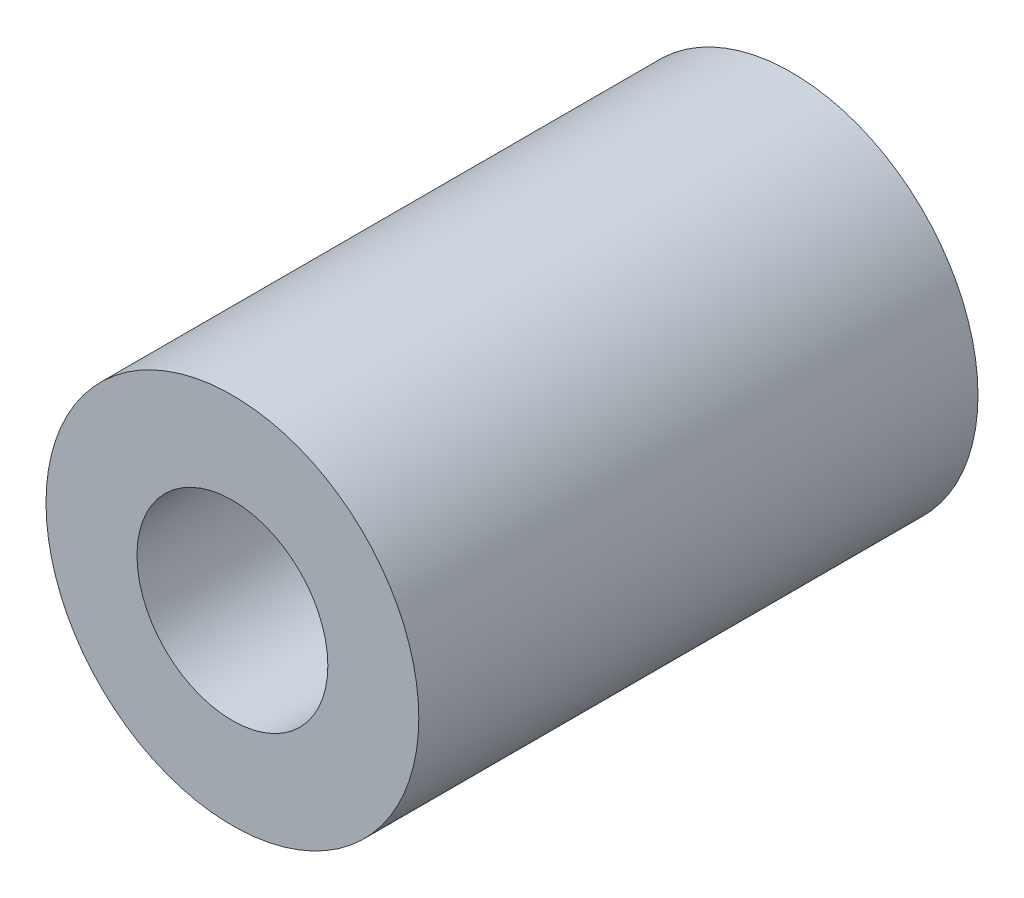
ISO-10303-21;
HEADER;
FILE_DESCRIPTION(('STEP AP214'),'2;1');
FILE_NAME('part.step','',(''),(''),'','','');
FILE_SCHEMA(('AUTOMOTIVE_DESIGN { 1 0 10303 214 1 1 1 1 }'));
ENDSEC;
DATA;
#1=APPLICATION_CONTEXT('core data for automotive mechanical design processes');
#2=APPLICATION_PROTOCOL_DEFINITION('international standard','automotive_design',2000,#1);
#3=PRODUCT_CONTEXT('',#1,'mechanical');
#4=PRODUCT('Part','Part','',(#3));
#5=PRODUCT_RELATED_PRODUCT_CATEGORY('part','',(#4));
#6=PRODUCT_DEFINITION_FORMATION('','',#4);
#7=PRODUCT_DEFINITION_CONTEXT('part definition',#1,'design');
#8=PRODUCT_DEFINITION('design','',#6,#7);
#9=PRODUCT_DEFINITION_SHAPE('','',#8);
#10=(LENGTH_UNIT() NAMED_UNIT(*) SI_UNIT(.MILLI.,.METRE.));
#11=(NAMED_UNIT(*) PLANE_ANGLE_UNIT() SI_UNIT($,.RADIAN.));
#12=(NAMED_UNIT(*) SI_UNIT($,.STERADIAN.) SOLID_ANGLE_UNIT());
#13=UNCERTAINTY_MEASURE_WITH_UNIT(LENGTH_MEASURE(1.E-05),#10,'distance_accuracy_value','');
#14=(GEOMETRIC_REPRESENTATION_CONTEXT(3) GLOBAL_UNCERTAINTY_ASSIGNED_CONTEXT((#13)) GLOBAL_UNIT_ASSIGNED_CONTEXT((#10,
#11,#12)) REPRESENTATION_CONTEXT('',''));
#15=CARTESIAN_POINT('',(0.,0.,0.));
#16=DIRECTION('',(0.,0.,1.));
#17=DIRECTION('',(1.,0.,0.));
#18=AXIS2_PLACEMENT_3D('',#15,#16,#17);
#19=CARTESIAN_POINT('',(0.,0.,7.14375));
#20=DIRECTION('',(0.,0.,-1.));
#21=DIRECTION('',(-1.,0.,0.));
#22=AXIS2_PLACEMENT_3D('',#19,#20,#21);
#23=CYLINDRICAL_SURFACE('',#22,2.4384);
#24=CARTESIAN_POINT('',(0.,0.,-7.14375));
#25=DIRECTION('',(0.,0.,-1.));
#26=DIRECTION('',(-1.,0.,0.));
#27=AXIS2_PLACEMENT_3D('',#24,#25,#26);
#28=CIRCLE('',#27,2.4384);
#29=CARTESIAN_POINT('',(-2.4384,0.,-7.14375));
#30=VERTEX_POINT('',#29);
#31=EDGE_CURVE('E38',#30,#30,#28,.T.);
#32=ORIENTED_EDGE('',*,*,#31,.T.);
#33=EDGE_LOOP('',(#32));
#34=FACE_BOUND('',#33,.T.);
#35=CARTESIAN_POINT('',(0.,0.,7.14375));
#36=DIRECTION('',(0.,0.,-1.));
#37=DIRECTION('',(-1.,0.,0.));
#38=AXIS2_PLACEMENT_3D('',#35,#36,#37);
#39=CIRCLE('',#38,2.4384);
#40=CARTESIAN_POINT('',(-2.4384,0.,7.14375));
#41=VERTEX_POINT('',#40);
#42=EDGE_CURVE('E25',#41,#41,#39,.T.);
#43=ORIENTED_EDGE('',*,*,#42,.F.);
#44=EDGE_LOOP('',(#43));
#45=FACE_BOUND('',#44,.T.);
#46=ADVANCED_FACE('F22',(#34,#45),#23,.F.);
#47=CARTESIAN_POINT('',(0.,0.,7.14375));
#48=DIRECTION('',(0.,0.,1.));
#49=DIRECTION('',(1.,0.,0.));
#50=AXIS2_PLACEMENT_3D('',#47,#48,#49);
#51=PLANE('',#50);
#52=ORIENTED_EDGE('',*,*,#42,.T.);
#53=EDGE_LOOP('',(#52));
#54=FACE_BOUND('',#53,.T.);
#55=CARTESIAN_POINT('',(0.,0.,7.14375));
#56=DIRECTION('',(0.,0.,-1.));
#57=DIRECTION('',(-1.,0.,0.));
#58=AXIS2_PLACEMENT_3D('',#55,#56,#57);
#59=CIRCLE('',#58,4.7625);
#60=CARTESIAN_POINT('',(-4.7625,0.,7.14375));
#61=VERTEX_POINT('',#60);
#62=EDGE_CURVE('E30',#61,#61,#59,.T.);
#63=ORIENTED_EDGE('',*,*,#62,.F.);
#64=EDGE_LOOP('',(#63));
#65=FACE_BOUND('',#64,.T.);
#66=ADVANCED_FACE('F47',(#54,#65),#51,.T.);
#67=CARTESIAN_POINT('',(0.,0.,-7.14375));
#68=DIRECTION('',(0.,0.,1.));
#69=DIRECTION('',(1.,0.,0.));
#70=AXIS2_PLACEMENT_3D('',#67,#68,#69);
#71=PLANE('',#70);
#72=ORIENTED_EDGE('',*,*,#31,.F.);
#73=EDGE_LOOP('',(#72));
#74=FACE_BOUND('',#73,.T.);
#75=CARTESIAN_POINT('',(0.,0.,-7.14375));
#76=DIRECTION('',(0.,0.,-1.));
#77=DIRECTION('',(-1.,0.,0.));
#78=AXIS2_PLACEMENT_3D('',#75,#76,#77);
#79=CIRCLE('',#78,4.7625);
#80=CARTESIAN_POINT('',(-4.7625,0.,-7.14375));
#81=VERTEX_POINT('',#80);
#82=EDGE_CURVE('E12',#81,#81,#79,.F.);
#83=ORIENTED_EDGE('',*,*,#82,.F.);
#84=EDGE_LOOP('',(#83));
#85=FACE_BOUND('',#84,.T.);
#86=ADVANCED_FACE('F55',(#74,#85),#71,.F.);
#87=CARTESIAN_POINT('',(0.,0.,7.14375));
#88=DIRECTION('',(0.,0.,-1.));
#89=DIRECTION('',(-1.,0.,0.));
#90=AXIS2_PLACEMENT_3D('',#87,#88,#89);
#91=CYLINDRICAL_SURFACE('',#90,4.7625);
#92=ORIENTED_EDGE('',*,*,#82,.T.);
#93=EDGE_LOOP('',(#92));
#94=FACE_BOUND('',#93,.T.);
#95=ORIENTED_EDGE('',*,*,#62,.T.);
#96=EDGE_LOOP('',(#95));
#97=FACE_BOUND('',#96,.T.);
#98=ADVANCED_FACE('F56',(#94,#97),#91,.T.);
#99=CLOSED_SHELL('',(#46,#66,#86,#98));
#100=MANIFOLD_SOLID_BREP('B1',#99);
#101=ADVANCED_BREP_SHAPE_REPRESENTATION('',(#18,#100),#14);
#102=SHAPE_DEFINITION_REPRESENTATION(#9,#101);
ENDSEC;
END-ISO-10303-21;
